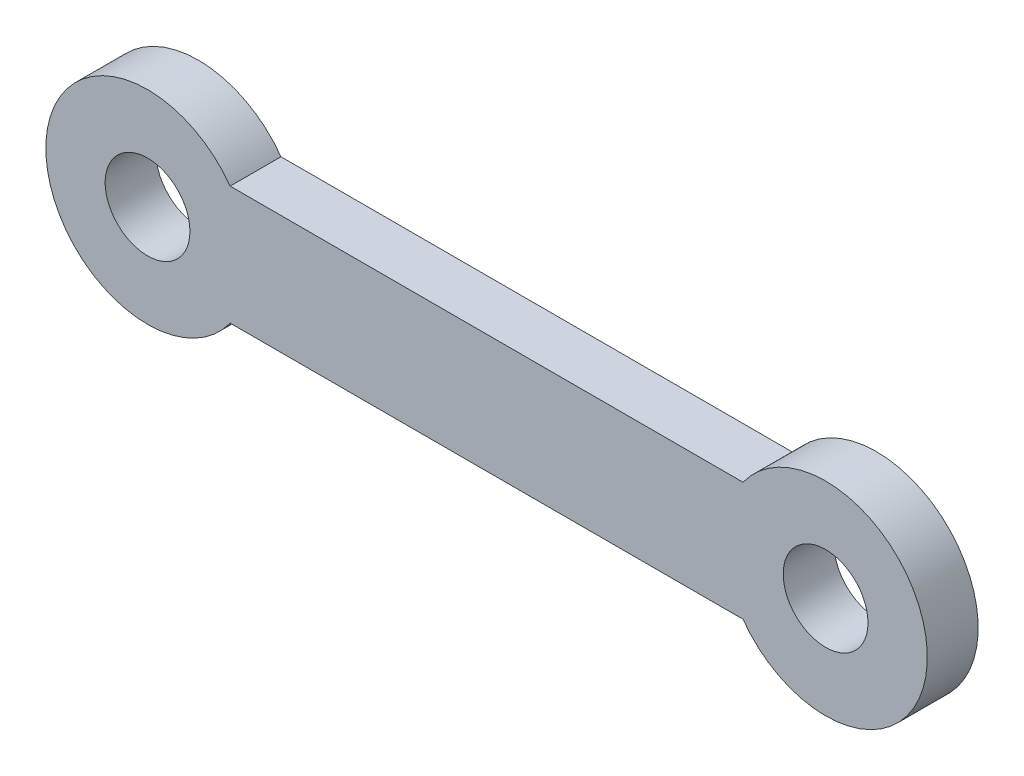
ISO-10303-21;
HEADER;
FILE_DESCRIPTION(('STEP AP214'),'2;1');
FILE_NAME('part.step','',(''),(''),'','','');
FILE_SCHEMA(('AUTOMOTIVE_DESIGN { 1 0 10303 214 1 1 1 1 }'));
ENDSEC;
DATA;
#1=APPLICATION_CONTEXT('core data for automotive mechanical design processes');
#2=APPLICATION_PROTOCOL_DEFINITION('international standard','automotive_design',2000,#1);
#3=PRODUCT_CONTEXT('',#1,'mechanical');
#4=PRODUCT('Part','Part','',(#3));
#5=PRODUCT_RELATED_PRODUCT_CATEGORY('part','',(#4));
#6=PRODUCT_DEFINITION_FORMATION('','',#4);
#7=PRODUCT_DEFINITION_CONTEXT('part definition',#1,'design');
#8=PRODUCT_DEFINITION('design','',#6,#7);
#9=PRODUCT_DEFINITION_SHAPE('','',#8);
#10=(LENGTH_UNIT() NAMED_UNIT(*) SI_UNIT(.MILLI.,.METRE.));
#11=(NAMED_UNIT(*) PLANE_ANGLE_UNIT() SI_UNIT($,.RADIAN.));
#12=(NAMED_UNIT(*) SI_UNIT($,.STERADIAN.) SOLID_ANGLE_UNIT());
#13=UNCERTAINTY_MEASURE_WITH_UNIT(LENGTH_MEASURE(1.E-05),#10,'distance_accuracy_value','');
#14=(GEOMETRIC_REPRESENTATION_CONTEXT(3) GLOBAL_UNCERTAINTY_ASSIGNED_CONTEXT((#13)) GLOBAL_UNIT_ASSIGNED_CONTEXT((#10,
#11,#12)) REPRESENTATION_CONTEXT('',''));
#15=CARTESIAN_POINT('',(0.,0.,0.));
#16=DIRECTION('',(0.,0.,1.));
#17=DIRECTION('',(1.,0.,0.));
#18=AXIS2_PLACEMENT_3D('',#15,#16,#17);
#19=CARTESIAN_POINT('',(39.9999974653742,0.,3.));
#20=DIRECTION('',(0.,0.,-1.));
#21=DIRECTION('',(-1.,0.,0.));
#22=AXIS2_PLACEMENT_3D('',#19,#20,#21);
#23=CYLINDRICAL_SURFACE('',#22,12.0000025346258);
#24=CARTESIAN_POINT('',(39.9999974653742,0.,-3.));
#25=DIRECTION('',(0.,0.,1.));
#26=DIRECTION('',(-1.,0.,0.));
#27=AXIS2_PLACEMENT_3D('',#24,#25,#26);
#28=CIRCLE('',#27,12.0000025346258);
#29=CARTESIAN_POINT('',(30.2532,-7.,-3.));
#30=VERTEX_POINT('',#29);
#31=CARTESIAN_POINT('',(30.2532,7.,-3.));
#32=VERTEX_POINT('',#31);
#33=EDGE_CURVE('E121',#30,#32,#28,.T.);
#34=ORIENTED_EDGE('',*,*,#33,.T.);
#35=DIRECTION('',(0.,0.,-1.));
#36=VECTOR('',#35,1.);
#37=CARTESIAN_POINT('',(30.2532,7.,3.));
#38=LINE('',#37,#36);
#39=CARTESIAN_POINT('',(30.2532,7.,3.));
#40=VERTEX_POINT('',#39);
#41=EDGE_CURVE('E11',#40,#32,#38,.T.);
#42=ORIENTED_EDGE('',*,*,#41,.F.);
#43=CARTESIAN_POINT('',(39.9999974653742,0.,3.));
#44=DIRECTION('',(0.,0.,1.));
#45=DIRECTION('',(-1.,0.,0.));
#46=AXIS2_PLACEMENT_3D('',#43,#44,#45);
#47=CIRCLE('',#46,12.0000025346258);
#48=CARTESIAN_POINT('',(30.2532,-7.,3.));
#49=VERTEX_POINT('',#48);
#50=EDGE_CURVE('E104',#49,#40,#47,.T.);
#51=ORIENTED_EDGE('',*,*,#50,.F.);
#52=DIRECTION('',(0.,0.,-1.));
#53=VECTOR('',#52,1.);
#54=CARTESIAN_POINT('',(30.2532,-7.,3.));
#55=LINE('',#54,#53);
#56=EDGE_CURVE('E117',#49,#30,#55,.T.);
#57=ORIENTED_EDGE('',*,*,#56,.T.);
#58=EDGE_LOOP('',(#34,#42,#51,#57));
#59=FACE_BOUND('',#58,.T.);
#60=ADVANCED_FACE('F51',(#59),#23,.T.);
#61=CARTESIAN_POINT('',(-30.2532,7.,3.));
#62=DIRECTION('',(0.,-1.,0.));
#63=DIRECTION('',(0.,0.,-1.));
#64=AXIS2_PLACEMENT_3D('',#61,#62,#63);
#65=PLANE('',#64);
#66=DIRECTION('',(-1.,0.,0.));
#67=VECTOR('',#66,1.);
#68=CARTESIAN_POINT('',(-30.2532,7.,-3.));
#69=LINE('',#68,#67);
#70=CARTESIAN_POINT('',(-30.2532,7.,-3.));
#71=VERTEX_POINT('',#70);
#72=EDGE_CURVE('E109',#32,#71,#69,.T.);
#73=ORIENTED_EDGE('',*,*,#72,.T.);
#74=DIRECTION('',(0.,0.,-1.));
#75=VECTOR('',#74,1.);
#76=CARTESIAN_POINT('',(-30.2532,7.,3.));
#77=LINE('',#76,#75);
#78=CARTESIAN_POINT('',(-30.2532,7.,3.));
#79=VERTEX_POINT('',#78);
#80=EDGE_CURVE('E61',#79,#71,#77,.T.);
#81=ORIENTED_EDGE('',*,*,#80,.F.);
#82=DIRECTION('',(-1.,0.,0.));
#83=VECTOR('',#82,1.);
#84=CARTESIAN_POINT('',(-30.2532,7.,3.));
#85=LINE('',#84,#83);
#86=EDGE_CURVE('E99',#40,#79,#85,.T.);
#87=ORIENTED_EDGE('',*,*,#86,.F.);
#88=ORIENTED_EDGE('',*,*,#41,.T.);
#89=EDGE_LOOP('',(#73,#81,#87,#88));
#90=FACE_BOUND('',#89,.T.);
#91=ADVANCED_FACE('F108',(#90),#65,.F.);
#92=CARTESIAN_POINT('',(-39.9999974653742,0.,3.));
#93=DIRECTION('',(0.,0.,-1.));
#94=DIRECTION('',(-1.,0.,0.));
#95=AXIS2_PLACEMENT_3D('',#92,#93,#94);
#96=CYLINDRICAL_SURFACE('',#95,12.0000025346258);
#97=CARTESIAN_POINT('',(-39.9999974653742,0.,-3.));
#98=DIRECTION('',(0.,0.,1.));
#99=DIRECTION('',(-1.,0.,0.));
#100=AXIS2_PLACEMENT_3D('',#97,#98,#99);
#101=CIRCLE('',#100,12.0000025346258);
#102=CARTESIAN_POINT('',(-30.2532,-7.,-3.));
#103=VERTEX_POINT('',#102);
#104=EDGE_CURVE('E86',#71,#103,#101,.T.);
#105=ORIENTED_EDGE('',*,*,#104,.T.);
#106=DIRECTION('',(0.,0.,-1.));
#107=VECTOR('',#106,1.);
#108=CARTESIAN_POINT('',(-30.2532,-7.,3.));
#109=LINE('',#108,#107);
#110=CARTESIAN_POINT('',(-30.2532,-7.,3.));
#111=VERTEX_POINT('',#110);
#112=EDGE_CURVE('E111',#111,#103,#109,.T.);
#113=ORIENTED_EDGE('',*,*,#112,.F.);
#114=CARTESIAN_POINT('',(-39.9999974653742,0.,3.));
#115=DIRECTION('',(0.,0.,1.));
#116=DIRECTION('',(-1.,0.,0.));
#117=AXIS2_PLACEMENT_3D('',#114,#115,#116);
#118=CIRCLE('',#117,12.0000025346258);
#119=EDGE_CURVE('E102',#79,#111,#118,.T.);
#120=ORIENTED_EDGE('',*,*,#119,.F.);
#121=ORIENTED_EDGE('',*,*,#80,.T.);
#122=EDGE_LOOP('',(#105,#113,#120,#121));
#123=FACE_BOUND('',#122,.T.);
#124=ADVANCED_FACE('F112',(#123),#96,.T.);
#125=CARTESIAN_POINT('',(30.2532,-7.,3.));
#126=DIRECTION('',(0.,1.,0.));
#127=DIRECTION('',(0.,0.,1.));
#128=AXIS2_PLACEMENT_3D('',#125,#126,#127);
#129=PLANE('',#128);
#130=DIRECTION('',(1.,0.,0.));
#131=VECTOR('',#130,1.);
#132=CARTESIAN_POINT('',(30.2532,-7.,-3.));
#133=LINE('',#132,#131);
#134=EDGE_CURVE('E92',#103,#30,#133,.T.);
#135=ORIENTED_EDGE('',*,*,#134,.T.);
#136=ORIENTED_EDGE('',*,*,#56,.F.);
#137=DIRECTION('',(1.,0.,0.));
#138=VECTOR('',#137,1.);
#139=CARTESIAN_POINT('',(30.2532,-7.,3.));
#140=LINE('',#139,#138);
#141=EDGE_CURVE('E69',#111,#49,#140,.T.);
#142=ORIENTED_EDGE('',*,*,#141,.F.);
#143=ORIENTED_EDGE('',*,*,#112,.T.);
#144=EDGE_LOOP('',(#135,#136,#142,#143));
#145=FACE_BOUND('',#144,.T.);
#146=ADVANCED_FACE('F135',(#145),#129,.F.);
#147=CARTESIAN_POINT('',(39.9999974653742,0.,3.));
#148=DIRECTION('',(0.,0.,-1.));
#149=DIRECTION('',(-1.,0.,0.));
#150=AXIS2_PLACEMENT_3D('',#147,#148,#149);
#151=PLANE('',#150);
#152=CARTESIAN_POINT('',(-40.,0.,3.));
#153=DIRECTION('',(0.,0.,1.));
#154=DIRECTION('',(1.,0.,0.));
#155=AXIS2_PLACEMENT_3D('',#152,#153,#154);
#156=CIRCLE('',#155,5.);
#157=CARTESIAN_POINT('',(-35.,0.,3.));
#158=VERTEX_POINT('',#157);
#159=EDGE_CURVE('E149',#158,#158,#156,.T.);
#160=ORIENTED_EDGE('',*,*,#159,.F.);
#161=EDGE_LOOP('',(#160));
#162=FACE_BOUND('',#161,.T.);
#163=CARTESIAN_POINT('',(40.,0.,3.));
#164=DIRECTION('',(0.,0.,1.));
#165=DIRECTION('',(1.,0.,0.));
#166=AXIS2_PLACEMENT_3D('',#163,#164,#165);
#167=CIRCLE('',#166,5.);
#168=CARTESIAN_POINT('',(45.,0.,3.));
#169=VERTEX_POINT('',#168);
#170=EDGE_CURVE('E145',#169,#169,#167,.T.);
#171=ORIENTED_EDGE('',*,*,#170,.F.);
#172=EDGE_LOOP('',(#171));
#173=FACE_BOUND('',#172,.T.);
#174=ORIENTED_EDGE('',*,*,#50,.T.);
#175=ORIENTED_EDGE('',*,*,#86,.T.);
#176=ORIENTED_EDGE('',*,*,#119,.T.);
#177=ORIENTED_EDGE('',*,*,#141,.T.);
#178=EDGE_LOOP('',(#174,#175,#176,#177));
#179=FACE_BOUND('',#178,.T.);
#180=ADVANCED_FACE('F100',(#162,#173,#179),#151,.F.);
#181=CARTESIAN_POINT('',(39.9999974653742,0.,-3.));
#182=DIRECTION('',(0.,0.,-1.));
#183=DIRECTION('',(-1.,0.,0.));
#184=AXIS2_PLACEMENT_3D('',#181,#182,#183);
#185=PLANE('',#184);
#186=CARTESIAN_POINT('',(-40.,0.,-3.));
#187=DIRECTION('',(0.,0.,1.));
#188=DIRECTION('',(1.,0.,0.));
#189=AXIS2_PLACEMENT_3D('',#186,#187,#188);
#190=CIRCLE('',#189,5.);
#191=CARTESIAN_POINT('',(-35.,0.,-3.));
#192=VERTEX_POINT('',#191);
#193=EDGE_CURVE('E125',#192,#192,#190,.T.);
#194=ORIENTED_EDGE('',*,*,#193,.T.);
#195=EDGE_LOOP('',(#194));
#196=FACE_BOUND('',#195,.T.);
#197=CARTESIAN_POINT('',(40.,0.,-3.));
#198=DIRECTION('',(0.,0.,1.));
#199=DIRECTION('',(1.,0.,0.));
#200=AXIS2_PLACEMENT_3D('',#197,#198,#199);
#201=CIRCLE('',#200,5.);
#202=CARTESIAN_POINT('',(45.,0.,-3.));
#203=VERTEX_POINT('',#202);
#204=EDGE_CURVE('E142',#203,#203,#201,.T.);
#205=ORIENTED_EDGE('',*,*,#204,.T.);
#206=EDGE_LOOP('',(#205));
#207=FACE_BOUND('',#206,.T.);
#208=ORIENTED_EDGE('',*,*,#33,.F.);
#209=ORIENTED_EDGE('',*,*,#134,.F.);
#210=ORIENTED_EDGE('',*,*,#104,.F.);
#211=ORIENTED_EDGE('',*,*,#72,.F.);
#212=EDGE_LOOP('',(#208,#209,#210,#211));
#213=FACE_BOUND('',#212,.T.);
#214=ADVANCED_FACE('F138',(#196,#207,#213),#185,.T.);
#215=CARTESIAN_POINT('',(40.,0.,-3.));
#216=DIRECTION('',(0.,0.,1.));
#217=DIRECTION('',(1.,0.,0.));
#218=AXIS2_PLACEMENT_3D('',#215,#216,#217);
#219=CYLINDRICAL_SURFACE('',#218,5.);
#220=ORIENTED_EDGE('',*,*,#204,.F.);
#221=EDGE_LOOP('',(#220));
#222=FACE_BOUND('',#221,.T.);
#223=ORIENTED_EDGE('',*,*,#170,.T.);
#224=EDGE_LOOP('',(#223));
#225=FACE_BOUND('',#224,.T.);
#226=ADVANCED_FACE('F162',(#222,#225),#219,.F.);
#227=CARTESIAN_POINT('',(-40.,0.,-3.));
#228=DIRECTION('',(0.,0.,1.));
#229=DIRECTION('',(1.,0.,0.));
#230=AXIS2_PLACEMENT_3D('',#227,#228,#229);
#231=CYLINDRICAL_SURFACE('',#230,5.);
#232=ORIENTED_EDGE('',*,*,#193,.F.);
#233=EDGE_LOOP('',(#232));
#234=FACE_BOUND('',#233,.T.);
#235=ORIENTED_EDGE('',*,*,#159,.T.);
#236=EDGE_LOOP('',(#235));
#237=FACE_BOUND('',#236,.T.);
#238=ADVANCED_FACE('F159',(#234,#237),#231,.F.);
#239=CLOSED_SHELL('',(#60,#91,#124,#146,#180,#214,#226,#238));
#240=MANIFOLD_SOLID_BREP('B2',#239);
#241=ADVANCED_BREP_SHAPE_REPRESENTATION('',(#18,#240),#14);
#242=SHAPE_DEFINITION_REPRESENTATION(#9,#241);
ENDSEC;
END-ISO-10303-21;
